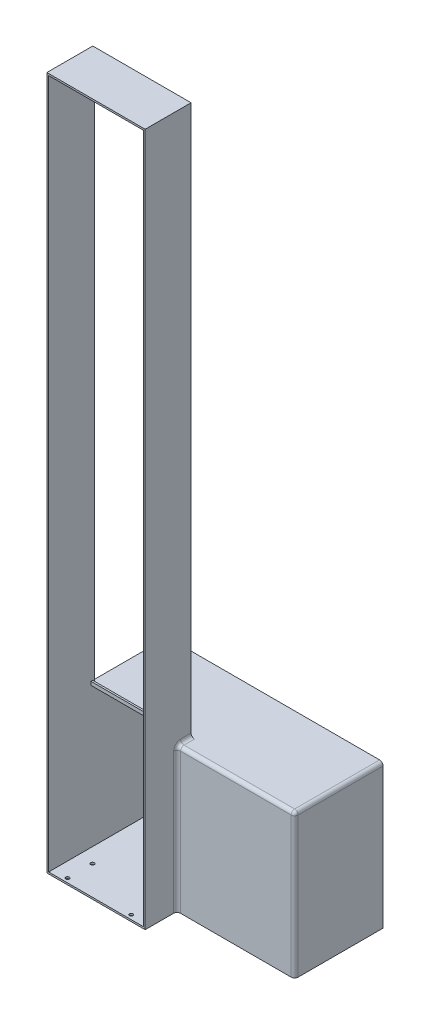
ISO-10303-21;
HEADER;
FILE_DESCRIPTION(('STEP AP214'),'2;1');
FILE_NAME('part.step','',(''),(''),'','','');
FILE_SCHEMA(('AUTOMOTIVE_DESIGN { 1 0 10303 214 1 1 1 1 }'));
ENDSEC;
DATA;
#1=APPLICATION_CONTEXT('core data for automotive mechanical design processes');
#2=APPLICATION_PROTOCOL_DEFINITION('international standard','automotive_design',2000,#1);
#3=PRODUCT_CONTEXT('',#1,'mechanical');
#4=PRODUCT('Part','Part','',(#3));
#5=PRODUCT_RELATED_PRODUCT_CATEGORY('part','',(#4));
#6=PRODUCT_DEFINITION_FORMATION('','',#4);
#7=PRODUCT_DEFINITION_CONTEXT('part definition',#1,'design');
#8=PRODUCT_DEFINITION('design','',#6,#7);
#9=PRODUCT_DEFINITION_SHAPE('','',#8);
#10=(LENGTH_UNIT() NAMED_UNIT(*) SI_UNIT(.MILLI.,.METRE.));
#11=(NAMED_UNIT(*) PLANE_ANGLE_UNIT() SI_UNIT($,.RADIAN.));
#12=(NAMED_UNIT(*) SI_UNIT($,.STERADIAN.) SOLID_ANGLE_UNIT());
#13=UNCERTAINTY_MEASURE_WITH_UNIT(LENGTH_MEASURE(1.E-05),#10,'distance_accuracy_value','');
#14=(GEOMETRIC_REPRESENTATION_CONTEXT(3) GLOBAL_UNCERTAINTY_ASSIGNED_CONTEXT((#13)) GLOBAL_UNIT_ASSIGNED_CONTEXT((#10,
#11,#12)) REPRESENTATION_CONTEXT('',''));
#15=CARTESIAN_POINT('',(0.,0.,0.));
#16=DIRECTION('',(0.,0.,1.));
#17=DIRECTION('',(1.,0.,0.));
#18=AXIS2_PLACEMENT_3D('',#15,#16,#17);
#19=CARTESIAN_POINT('',(-135.,-585.61875,-252.6145));
#20=DIRECTION('',(-1.,0.,0.));
#21=DIRECTION('',(0.,0.,1.));
#22=AXIS2_PLACEMENT_3D('',#19,#20,#21);
#23=PLANE('',#22);
#24=DIRECTION('',(0.,-1.,0.));
#25=VECTOR('',#24,1.);
#26=CARTESIAN_POINT('',(-135.,-585.61875,-35.3945000000002));
#27=LINE('',#26,#25);
#28=CARTESIAN_POINT('',(-135.,-575.61875,-35.3945000000002));
#29=VERTEX_POINT('',#28);
#30=CARTESIAN_POINT('',(-135.,-580.61875,-35.3945000000002));
#31=VERTEX_POINT('',#30);
#32=EDGE_CURVE('E470',#29,#31,#27,.T.);
#33=ORIENTED_EDGE('',*,*,#32,.T.);
#34=DIRECTION('',(0.,0.,1.));
#35=VECTOR('',#34,1.);
#36=CARTESIAN_POINT('',(-135.,-580.61875,0.));
#37=LINE('',#36,#35);
#38=CARTESIAN_POINT('',(-135.,-580.61875,-40.3945000000002));
#39=VERTEX_POINT('',#38);
#40=EDGE_CURVE('E367',#39,#31,#37,.T.);
#41=ORIENTED_EDGE('',*,*,#40,.F.);
#42=DIRECTION('',(0.,-1.,0.));
#43=VECTOR('',#42,1.);
#44=CARTESIAN_POINT('',(-135.,979.38125,-40.3945000000002));
#45=LINE('',#44,#43);
#46=CARTESIAN_POINT('',(-135.,979.38125,-40.3945000000002));
#47=VERTEX_POINT('',#46);
#48=EDGE_CURVE('E245',#47,#39,#45,.T.);
#49=ORIENTED_EDGE('',*,*,#48,.F.);
#50=DIRECTION('',(0.,0.,-1.));
#51=VECTOR('',#50,1.);
#52=CARTESIAN_POINT('',(-135.,979.38125,90.3874999999998));
#53=LINE('',#52,#51);
#54=CARTESIAN_POINT('',(-135.,979.38125,90.3874999999998));
#55=VERTEX_POINT('',#54);
#56=EDGE_CURVE('E239',#55,#47,#53,.T.);
#57=ORIENTED_EDGE('',*,*,#56,.F.);
#58=DIRECTION('',(0.,-1.,0.));
#59=VECTOR('',#58,1.);
#60=CARTESIAN_POINT('',(-135.,-585.61875,90.3874999999998));
#61=LINE('',#60,#59);
#62=CARTESIAN_POINT('',(-135.,-985.61875,90.3874999999998));
#63=VERTEX_POINT('',#62);
#64=EDGE_CURVE('E304',#55,#63,#61,.T.);
#65=ORIENTED_EDGE('',*,*,#64,.T.);
#66=DIRECTION('',(0.,0.,-1.));
#67=VECTOR('',#66,1.);
#68=CARTESIAN_POINT('',(-135.,-985.61875,-252.6145));
#69=LINE('',#68,#67);
#70=CARTESIAN_POINT('',(-135.,-985.61875,-252.6145));
#71=VERTEX_POINT('',#70);
#72=EDGE_CURVE('E298',#63,#71,#69,.T.);
#73=ORIENTED_EDGE('',*,*,#72,.T.);
#74=DIRECTION('',(0.,-1.,0.));
#75=VECTOR('',#74,1.);
#76=CARTESIAN_POINT('',(-135.,-585.61875,-252.6145));
#77=LINE('',#76,#75);
#78=CARTESIAN_POINT('',(-135.,-585.61875,-252.6145));
#79=VERTEX_POINT('',#78);
#80=EDGE_CURVE('E301',#79,#71,#77,.T.);
#81=ORIENTED_EDGE('',*,*,#80,.F.);
#82=DIRECTION('',(0.,0.,-1.));
#83=VECTOR('',#82,1.);
#84=CARTESIAN_POINT('',(-135.,-585.61875,-252.6145));
#85=LINE('',#84,#83);
#86=CARTESIAN_POINT('',(-135.,-585.61875,-30.3945000000002));
#87=VERTEX_POINT('',#86);
#88=EDGE_CURVE('E50',#87,#79,#85,.T.);
#89=ORIENTED_EDGE('',*,*,#88,.F.);
#90=DIRECTION('',(0.,1.,0.));
#91=VECTOR('',#90,1.);
#92=CARTESIAN_POINT('',(-135.,-585.61875,-30.3945000000002));
#93=LINE('',#92,#91);
#94=CARTESIAN_POINT('',(-135.,-575.61875,-30.3945000000002));
#95=VERTEX_POINT('',#94);
#96=EDGE_CURVE('E54',#87,#95,#93,.T.);
#97=ORIENTED_EDGE('',*,*,#96,.T.);
#98=DIRECTION('',(0.,0.,-1.));
#99=VECTOR('',#98,1.);
#100=CARTESIAN_POINT('',(-135.,-575.61875,-35.3945000000002));
#101=LINE('',#100,#99);
#102=EDGE_CURVE('E472',#95,#29,#101,.T.);
#103=ORIENTED_EDGE('',*,*,#102,.T.);
#104=EDGE_LOOP('',(#33,#41,#49,#57,#65,#73,#81,#89,#97,#103));
#105=FACE_BOUND('',#104,.T.);
#106=ADVANCED_FACE('F33',(#105),#23,.F.);
#107=CARTESIAN_POINT('',(135.,-585.61875,90.3874999999998));
#108=DIRECTION('',(1.,0.,0.));
#109=DIRECTION('',(0.,0.,-1.));
#110=AXIS2_PLACEMENT_3D('',#107,#108,#109);
#111=PLANE('',#110);
#112=DIRECTION('',(0.,-1.,0.));
#113=VECTOR('',#112,1.);
#114=CARTESIAN_POINT('',(135.,-585.61875,-35.3945000000002));
#115=LINE('',#114,#113);
#116=CARTESIAN_POINT('',(135.,-575.61875,-35.3945000000003));
#117=VERTEX_POINT('',#116);
#118=CARTESIAN_POINT('',(135.,-580.61875,-35.3945000000002));
#119=VERTEX_POINT('',#118);
#120=EDGE_CURVE('E485',#117,#119,#115,.T.);
#121=ORIENTED_EDGE('',*,*,#120,.F.);
#122=DIRECTION('',(0.,0.,-1.));
#123=VECTOR('',#122,1.);
#124=CARTESIAN_POINT('',(135.,-575.61875,-35.3945000000002));
#125=LINE('',#124,#123);
#126=CARTESIAN_POINT('',(135.,-575.61875,-30.3945000000002));
#127=VERTEX_POINT('',#126);
#128=EDGE_CURVE('E478',#127,#117,#125,.T.);
#129=ORIENTED_EDGE('',*,*,#128,.F.);
#130=DIRECTION('',(0.,1.,0.));
#131=VECTOR('',#130,1.);
#132=CARTESIAN_POINT('',(135.,-585.61875,-30.3945000000002));
#133=LINE('',#132,#131);
#134=CARTESIAN_POINT('',(135.,-585.61875,-30.3945000000002));
#135=VERTEX_POINT('',#134);
#136=EDGE_CURVE('E484',#135,#127,#133,.T.);
#137=ORIENTED_EDGE('',*,*,#136,.F.);
#138=DIRECTION('',(0.,0.,1.));
#139=VECTOR('',#138,1.);
#140=CARTESIAN_POINT('',(135.,-585.61875,90.3874999999998));
#141=LINE('',#140,#139);
#142=CARTESIAN_POINT('',(135.,-585.61875,-5.53750000000025));
#143=VERTEX_POINT('',#142);
#144=EDGE_CURVE('E262',#135,#143,#141,.T.);
#145=ORIENTED_EDGE('',*,*,#144,.T.);
#146=DIRECTION('',(0.,-1.,0.));
#147=VECTOR('',#146,1.);
#148=CARTESIAN_POINT('',(135.,-585.61875,-5.53750000000025));
#149=LINE('',#148,#147);
#150=CARTESIAN_POINT('',(135.,-985.61875,-5.53750000000025));
#151=VERTEX_POINT('',#150);
#152=EDGE_CURVE('E290',#143,#151,#149,.T.);
#153=ORIENTED_EDGE('',*,*,#152,.T.);
#154=DIRECTION('',(0.,0.,1.));
#155=VECTOR('',#154,1.);
#156=CARTESIAN_POINT('',(135.,-985.61875,90.3874999999998));
#157=LINE('',#156,#155);
#158=CARTESIAN_POINT('',(135.,-985.61875,90.3874999999998));
#159=VERTEX_POINT('',#158);
#160=EDGE_CURVE('E280',#151,#159,#157,.T.);
#161=ORIENTED_EDGE('',*,*,#160,.T.);
#162=DIRECTION('',(0.,-1.,0.));
#163=VECTOR('',#162,1.);
#164=CARTESIAN_POINT('',(135.,-585.61875,90.3874999999998));
#165=LINE('',#164,#163);
#166=CARTESIAN_POINT('',(135.,979.38125,90.3874999999998));
#167=VERTEX_POINT('',#166);
#168=EDGE_CURVE('E283',#167,#159,#165,.T.);
#169=ORIENTED_EDGE('',*,*,#168,.F.);
#170=DIRECTION('',(0.,0.,1.));
#171=VECTOR('',#170,1.);
#172=CARTESIAN_POINT('',(135.,979.38125,90.3874999999998));
#173=LINE('',#172,#171);
#174=CARTESIAN_POINT('',(135.,979.38125,-40.3945000000002));
#175=VERTEX_POINT('',#174);
#176=EDGE_CURVE('E248',#175,#167,#173,.T.);
#177=ORIENTED_EDGE('',*,*,#176,.F.);
#178=DIRECTION('',(0.,-1.,0.));
#179=VECTOR('',#178,1.);
#180=CARTESIAN_POINT('',(135.,979.38125,-40.3945000000002));
#181=LINE('',#180,#179);
#182=CARTESIAN_POINT('',(135.,-580.61875,-40.3945000000002));
#183=VERTEX_POINT('',#182);
#184=EDGE_CURVE('E251',#175,#183,#181,.T.);
#185=ORIENTED_EDGE('',*,*,#184,.T.);
#186=DIRECTION('',(0.,0.,1.));
#187=VECTOR('',#186,1.);
#188=CARTESIAN_POINT('',(135.,-580.61875,90.3874999999998));
#189=LINE('',#188,#187);
#190=EDGE_CURVE('E252',#183,#119,#189,.T.);
#191=ORIENTED_EDGE('',*,*,#190,.T.);
#192=EDGE_LOOP('',(#121,#129,#137,#145,#153,#161,#169,#177,#185,#191));
#193=FACE_BOUND('',#192,.T.);
#194=ADVANCED_FACE('F498',(#193),#111,.F.);
#195=CARTESIAN_POINT('',(0.,-580.61875,0.));
#196=DIRECTION('',(0.,1.,0.));
#197=DIRECTION('',(0.,0.,1.));
#198=AXIS2_PLACEMENT_3D('',#195,#196,#197);
#199=PLANE('',#198);
#200=DIRECTION('',(1.,0.,0.));
#201=VECTOR('',#200,1.);
#202=CARTESIAN_POINT('',(474.951,-580.61875,-10.5375000000003));
#203=LINE('',#202,#201);
#204=CARTESIAN_POINT('',(150.,-580.61875,-10.5375000000003));
#205=VERTEX_POINT('',#204);
#206=CARTESIAN_POINT('',(464.951,-580.61875,-10.5375000000003));
#207=VERTEX_POINT('',#206);
#208=EDGE_CURVE('E385',#205,#207,#203,.T.);
#209=ORIENTED_EDGE('',*,*,#208,.T.);
#210=DIRECTION('',(0.,0.,-1.));
#211=VECTOR('',#210,1.);
#212=CARTESIAN_POINT('',(464.951,-580.61875,-252.6145));
#213=LINE('',#212,#211);
#214=CARTESIAN_POINT('',(464.951,-580.61875,-252.6145));
#215=VERTEX_POINT('',#214);
#216=EDGE_CURVE('E387',#207,#215,#213,.T.);
#217=ORIENTED_EDGE('',*,*,#216,.T.);
#218=DIRECTION('',(-1.,0.,0.));
#219=VECTOR('',#218,1.);
#220=CARTESIAN_POINT('',(-135.,-580.61875,-252.6145));
#221=LINE('',#220,#219);
#222=CARTESIAN_POINT('',(-140.,-580.61875,-252.6145));
#223=VERTEX_POINT('',#222);
#224=EDGE_CURVE('E263',#215,#223,#221,.T.);
#225=ORIENTED_EDGE('',*,*,#224,.T.);
#226=DIRECTION('',(0.,0.,1.));
#227=VECTOR('',#226,1.);
#228=CARTESIAN_POINT('',(-140.,-580.61875,-252.6145));
#229=LINE('',#228,#227);
#230=CARTESIAN_POINT('',(-140.,-580.61875,-40.3945000000002));
#231=VERTEX_POINT('',#230);
#232=EDGE_CURVE('E265',#223,#231,#229,.T.);
#233=ORIENTED_EDGE('',*,*,#232,.T.);
#234=DIRECTION('',(-1.,0.,0.));
#235=VECTOR('',#234,1.);
#236=CARTESIAN_POINT('',(-135.,-580.61875,-40.3945000000002));
#237=LINE('',#236,#235);
#238=EDGE_CURVE('E236',#39,#231,#237,.T.);
#239=ORIENTED_EDGE('',*,*,#238,.F.);
#240=ORIENTED_EDGE('',*,*,#40,.T.);
#241=DIRECTION('',(1.,0.,0.));
#242=VECTOR('',#241,1.);
#243=CARTESIAN_POINT('',(135.,-580.61875,-35.3945000000002));
#244=LINE('',#243,#242);
#245=EDGE_CURVE('E269',#31,#119,#244,.T.);
#246=ORIENTED_EDGE('',*,*,#245,.T.);
#247=ORIENTED_EDGE('',*,*,#190,.F.);
#248=DIRECTION('',(-1.,0.,0.));
#249=VECTOR('',#248,1.);
#250=CARTESIAN_POINT('',(135.,-580.61875,-40.3945000000002));
#251=LINE('',#250,#249);
#252=CARTESIAN_POINT('',(150.,-580.61875,-40.3945000000002));
#253=VERTEX_POINT('',#252);
#254=EDGE_CURVE('E247',#253,#183,#251,.T.);
#255=ORIENTED_EDGE('',*,*,#254,.F.);
#256=DIRECTION('',(0.,0.,-1.));
#257=VECTOR('',#256,1.);
#258=CARTESIAN_POINT('',(150.,-580.61875,0.));
#259=LINE('',#258,#257);
#260=EDGE_CURVE('E383',#253,#205,#259,.F.);
#261=ORIENTED_EDGE('',*,*,#260,.T.);
#262=EDGE_LOOP('',(#209,#217,#225,#233,#239,#240,#246,#247,#255,#261));
#263=FACE_BOUND('',#262,.T.);
#264=ADVANCED_FACE('F428',(#263),#199,.T.);
#265=CARTESIAN_POINT('',(0.,-985.61875,0.));
#266=DIRECTION('',(0.,1.,0.));
#267=DIRECTION('',(0.,0.,1.));
#268=AXIS2_PLACEMENT_3D('',#265,#266,#267);
#269=PLANE('',#268);
#270=CARTESIAN_POINT('',(-92.9999999999998,-985.61875,78.3874999999998));
#271=DIRECTION('',(0.,-1.,0.));
#272=DIRECTION('',(0.,0.,-1.));
#273=AXIS2_PLACEMENT_3D('',#270,#271,#272);
#274=CIRCLE('',#273,5.00000000000001);
#275=CARTESIAN_POINT('',(-92.9999999999998,-985.61875,73.3874999999998));
#276=VERTEX_POINT('',#275);
#277=EDGE_CURVE('E311',#276,#276,#274,.T.);
#278=ORIENTED_EDGE('',*,*,#277,.T.);
#279=EDGE_LOOP('',(#278));
#280=FACE_BOUND('',#279,.T.);
#281=CARTESIAN_POINT('',(88.0000000000002,-985.61875,7.38749999999978));
#282=DIRECTION('',(0.,-1.,0.));
#283=DIRECTION('',(0.,0.,-1.));
#284=AXIS2_PLACEMENT_3D('',#281,#282,#283);
#285=CIRCLE('',#284,5.);
#286=CARTESIAN_POINT('',(88.0000000000002,-985.61875,2.38749999999978));
#287=VERTEX_POINT('',#286);
#288=EDGE_CURVE('E323',#287,#287,#285,.T.);
#289=ORIENTED_EDGE('',*,*,#288,.T.);
#290=EDGE_LOOP('',(#289));
#291=FACE_BOUND('',#290,.T.);
#292=CARTESIAN_POINT('',(88.0000000000002,-985.61875,-194.6125));
#293=DIRECTION('',(0.,-1.,0.));
#294=DIRECTION('',(0.,0.,-1.));
#295=AXIS2_PLACEMENT_3D('',#292,#293,#294);
#296=CIRCLE('',#295,5.00000000000001);
#297=CARTESIAN_POINT('',(88.0000000000002,-985.61875,-199.6125));
#298=VERTEX_POINT('',#297);
#299=EDGE_CURVE('E335',#298,#298,#296,.T.);
#300=ORIENTED_EDGE('',*,*,#299,.T.);
#301=EDGE_LOOP('',(#300));
#302=FACE_BOUND('',#301,.T.);
#303=CARTESIAN_POINT('',(-92.9999999999998,-985.61875,-194.6125));
#304=DIRECTION('',(0.,-1.,0.));
#305=DIRECTION('',(0.,0.,-1.));
#306=AXIS2_PLACEMENT_3D('',#303,#304,#305);
#307=CIRCLE('',#306,5.00000000000001);
#308=CARTESIAN_POINT('',(-92.9999999999998,-985.61875,-199.6125));
#309=VERTEX_POINT('',#308);
#310=EDGE_CURVE('E329',#309,#309,#307,.T.);
#311=ORIENTED_EDGE('',*,*,#310,.T.);
#312=EDGE_LOOP('',(#311));
#313=FACE_BOUND('',#312,.T.);
#314=CARTESIAN_POINT('',(-92.9999999999998,-985.61875,7.38749999999978));
#315=DIRECTION('',(0.,-1.,0.));
#316=DIRECTION('',(0.,0.,-1.));
#317=AXIS2_PLACEMENT_3D('',#314,#315,#316);
#318=CIRCLE('',#317,5.);
#319=CARTESIAN_POINT('',(-92.9999999999998,-985.61875,2.38749999999978));
#320=VERTEX_POINT('',#319);
#321=EDGE_CURVE('E317',#320,#320,#318,.T.);
#322=ORIENTED_EDGE('',*,*,#321,.T.);
#323=EDGE_LOOP('',(#322));
#324=FACE_BOUND('',#323,.T.);
#325=CARTESIAN_POINT('',(88.0000000000002,-985.61875,78.3874999999998));
#326=DIRECTION('',(0.,-1.,0.));
#327=DIRECTION('',(0.,0.,-1.));
#328=AXIS2_PLACEMENT_3D('',#325,#326,#327);
#329=CIRCLE('',#328,5.00000000000001);
#330=CARTESIAN_POINT('',(88.0000000000002,-985.61875,73.3874999999998));
#331=VERTEX_POINT('',#330);
#332=EDGE_CURVE('E307',#331,#331,#329,.T.);
#333=ORIENTED_EDGE('',*,*,#332,.T.);
#334=EDGE_LOOP('',(#333));
#335=FACE_BOUND('',#334,.T.);
#336=DIRECTION('',(-1.,0.,0.));
#337=VECTOR('',#336,1.);
#338=CARTESIAN_POINT('',(135.,-985.61875,-5.53750000000025));
#339=LINE('',#338,#337);
#340=CARTESIAN_POINT('',(469.951,-985.61875,-5.53750000000025));
#341=VERTEX_POINT('',#340);
#342=EDGE_CURVE('E285',#341,#151,#339,.T.);
#343=ORIENTED_EDGE('',*,*,#342,.F.);
#344=DIRECTION('',(0.,0.,1.));
#345=VECTOR('',#344,1.);
#346=CARTESIAN_POINT('',(469.951,-985.61875,-5.53750000000025));
#347=LINE('',#346,#345);
#348=CARTESIAN_POINT('',(469.951,-985.61875,-252.6145));
#349=VERTEX_POINT('',#348);
#350=EDGE_CURVE('E275',#349,#341,#347,.T.);
#351=ORIENTED_EDGE('',*,*,#350,.F.);
#352=DIRECTION('',(1.,0.,0.));
#353=VECTOR('',#352,1.);
#354=CARTESIAN_POINT('',(474.951,-985.61875,-252.6145));
#355=LINE('',#354,#353);
#356=EDGE_CURVE('E341',#71,#349,#355,.T.);
#357=ORIENTED_EDGE('',*,*,#356,.F.);
#358=ORIENTED_EDGE('',*,*,#72,.F.);
#359=DIRECTION('',(-1.,0.,0.));
#360=VECTOR('',#359,1.);
#361=CARTESIAN_POINT('',(-140.,-985.61875,90.3874999999998));
#362=LINE('',#361,#360);
#363=EDGE_CURVE('E346',#159,#63,#362,.T.);
#364=ORIENTED_EDGE('',*,*,#363,.F.);
#365=ORIENTED_EDGE('',*,*,#160,.F.);
#366=EDGE_LOOP('',(#343,#351,#357,#358,#364,#365));
#367=FACE_BOUND('',#366,.T.);
#368=ADVANCED_FACE('F545',(#280,#291,#302,#313,#324,#335,#367),#269,.T.);
#369=CARTESIAN_POINT('',(0.,-990.61875,0.));
#370=DIRECTION('',(0.,1.,0.));
#371=DIRECTION('',(0.,0.,1.));
#372=AXIS2_PLACEMENT_3D('',#369,#370,#371);
#373=PLANE('',#372);
#374=DIRECTION('',(0.,0.,1.));
#375=VECTOR('',#374,1.);
#376=CARTESIAN_POINT('',(474.951,-990.61875,-0.537500000000255));
#377=LINE('',#376,#375);
#378=CARTESIAN_POINT('',(474.951,-990.61875,-252.6145));
#379=VERTEX_POINT('',#378);
#380=CARTESIAN_POINT('',(474.951,-990.61875,-10.5375000000003));
#381=VERTEX_POINT('',#380);
#382=EDGE_CURVE('E348',#379,#381,#377,.T.);
#383=ORIENTED_EDGE('',*,*,#382,.T.);
#384=CARTESIAN_POINT('',(464.951,-990.61875,-10.5375000000003));
#385=DIRECTION('',(0.,1.,0.));
#386=DIRECTION('',(0.,0.,1.));
#387=AXIS2_PLACEMENT_3D('',#384,#385,#386);
#388=CIRCLE('',#387,10.);
#389=CARTESIAN_POINT('',(464.951,-990.61875,-0.537500000000255));
#390=VERTEX_POINT('',#389);
#391=EDGE_CURVE('E381',#381,#390,#388,.F.);
#392=ORIENTED_EDGE('',*,*,#391,.T.);
#393=DIRECTION('',(-1.,0.,0.));
#394=VECTOR('',#393,1.);
#395=CARTESIAN_POINT('',(140.,-990.61875,-0.537500000000255));
#396=LINE('',#395,#394);
#397=CARTESIAN_POINT('',(150.,-990.61875,-0.537500000000255));
#398=VERTEX_POINT('',#397);
#399=EDGE_CURVE('E351',#390,#398,#396,.T.);
#400=ORIENTED_EDGE('',*,*,#399,.T.);
#401=CARTESIAN_POINT('',(150.,-990.61875,9.46249999999975));
#402=DIRECTION('',(0.,1.,0.));
#403=DIRECTION('',(0.,0.,1.));
#404=AXIS2_PLACEMENT_3D('',#401,#402,#403);
#405=CIRCLE('',#404,10.);
#406=CARTESIAN_POINT('',(140.,-990.61875,9.46249999999975));
#407=VERTEX_POINT('',#406);
#408=EDGE_CURVE('E11',#398,#407,#405,.T.);
#409=ORIENTED_EDGE('',*,*,#408,.T.);
#410=DIRECTION('',(0.,0.,1.));
#411=VECTOR('',#410,1.);
#412=CARTESIAN_POINT('',(140.,-990.61875,90.3874999999998));
#413=LINE('',#412,#411);
#414=CARTESIAN_POINT('',(140.,-990.61875,90.3874999999998));
#415=VERTEX_POINT('',#414);
#416=EDGE_CURVE('E354',#407,#415,#413,.T.);
#417=ORIENTED_EDGE('',*,*,#416,.T.);
#418=DIRECTION('',(-1.,0.,0.));
#419=VECTOR('',#418,1.);
#420=CARTESIAN_POINT('',(-140.,-990.61875,90.3874999999998));
#421=LINE('',#420,#419);
#422=CARTESIAN_POINT('',(-140.,-990.61875,90.3874999999998));
#423=VERTEX_POINT('',#422);
#424=EDGE_CURVE('E209',#415,#423,#421,.T.);
#425=ORIENTED_EDGE('',*,*,#424,.T.);
#426=DIRECTION('',(0.,0.,-1.));
#427=VECTOR('',#426,1.);
#428=CARTESIAN_POINT('',(-140.,-990.61875,-252.6145));
#429=LINE('',#428,#427);
#430=CARTESIAN_POINT('',(-140.,-990.61875,-252.6145));
#431=VERTEX_POINT('',#430);
#432=EDGE_CURVE('E205',#423,#431,#429,.T.);
#433=ORIENTED_EDGE('',*,*,#432,.T.);
#434=DIRECTION('',(1.,0.,0.));
#435=VECTOR('',#434,1.);
#436=CARTESIAN_POINT('',(474.951,-990.61875,-252.6145));
#437=LINE('',#436,#435);
#438=EDGE_CURVE('E345',#431,#379,#437,.T.);
#439=ORIENTED_EDGE('',*,*,#438,.T.);
#440=EDGE_LOOP('',(#383,#392,#400,#409,#417,#425,#433,#439));
#441=FACE_BOUND('',#440,.T.);
#442=CARTESIAN_POINT('',(88.0000000000002,-990.61875,-194.6125));
#443=DIRECTION('',(0.,-1.,0.));
#444=DIRECTION('',(0.,0.,-1.));
#445=AXIS2_PLACEMENT_3D('',#442,#443,#444);
#446=CIRCLE('',#445,5.00000000000001);
#447=CARTESIAN_POINT('',(88.0000000000002,-990.61875,-199.6125));
#448=VERTEX_POINT('',#447);
#449=EDGE_CURVE('E338',#448,#448,#446,.T.);
#450=ORIENTED_EDGE('',*,*,#449,.F.);
#451=EDGE_LOOP('',(#450));
#452=FACE_BOUND('',#451,.T.);
#453=CARTESIAN_POINT('',(-92.9999999999998,-990.61875,-194.6125));
#454=DIRECTION('',(0.,-1.,0.));
#455=DIRECTION('',(0.,0.,-1.));
#456=AXIS2_PLACEMENT_3D('',#453,#454,#455);
#457=CIRCLE('',#456,5.00000000000001);
#458=CARTESIAN_POINT('',(-92.9999999999998,-990.61875,-199.6125));
#459=VERTEX_POINT('',#458);
#460=EDGE_CURVE('E332',#459,#459,#457,.T.);
#461=ORIENTED_EDGE('',*,*,#460,.F.);
#462=EDGE_LOOP('',(#461));
#463=FACE_BOUND('',#462,.T.);
#464=CARTESIAN_POINT('',(88.0000000000002,-990.61875,7.38749999999978));
#465=DIRECTION('',(0.,-1.,0.));
#466=DIRECTION('',(0.,0.,-1.));
#467=AXIS2_PLACEMENT_3D('',#464,#465,#466);
#468=CIRCLE('',#467,5.);
#469=CARTESIAN_POINT('',(88.0000000000002,-990.61875,2.38749999999978));
#470=VERTEX_POINT('',#469);
#471=EDGE_CURVE('E326',#470,#470,#468,.T.);
#472=ORIENTED_EDGE('',*,*,#471,.F.);
#473=EDGE_LOOP('',(#472));
#474=FACE_BOUND('',#473,.T.);
#475=CARTESIAN_POINT('',(-92.9999999999998,-990.61875,7.38749999999978));
#476=DIRECTION('',(0.,-1.,0.));
#477=DIRECTION('',(0.,0.,-1.));
#478=AXIS2_PLACEMENT_3D('',#475,#476,#477);
#479=CIRCLE('',#478,5.);
#480=CARTESIAN_POINT('',(-92.9999999999998,-990.61875,2.38749999999978));
#481=VERTEX_POINT('',#480);
#482=EDGE_CURVE('E320',#481,#481,#479,.T.);
#483=ORIENTED_EDGE('',*,*,#482,.F.);
#484=EDGE_LOOP('',(#483));
#485=FACE_BOUND('',#484,.T.);
#486=CARTESIAN_POINT('',(-92.9999999999998,-990.61875,78.3874999999998));
#487=DIRECTION('',(0.,-1.,0.));
#488=DIRECTION('',(0.,0.,-1.));
#489=AXIS2_PLACEMENT_3D('',#486,#487,#488);
#490=CIRCLE('',#489,5.00000000000001);
#491=CARTESIAN_POINT('',(-92.9999999999998,-990.61875,73.3874999999998));
#492=VERTEX_POINT('',#491);
#493=EDGE_CURVE('E314',#492,#492,#490,.T.);
#494=ORIENTED_EDGE('',*,*,#493,.F.);
#495=EDGE_LOOP('',(#494));
#496=FACE_BOUND('',#495,.T.);
#497=CARTESIAN_POINT('',(88.0000000000002,-990.61875,78.3874999999998));
#498=DIRECTION('',(0.,-1.,0.));
#499=DIRECTION('',(0.,0.,-1.));
#500=AXIS2_PLACEMENT_3D('',#497,#498,#499);
#501=CIRCLE('',#500,5.00000000000001);
#502=CARTESIAN_POINT('',(88.0000000000002,-990.61875,73.3874999999998));
#503=VERTEX_POINT('',#502);
#504=EDGE_CURVE('E308',#503,#503,#501,.T.);
#505=ORIENTED_EDGE('',*,*,#504,.F.);
#506=EDGE_LOOP('',(#505));
#507=FACE_BOUND('',#506,.T.);
#508=ADVANCED_FACE('F446',(#441,#452,#463,#474,#485,#496,#507),#373,.F.);
#509=CARTESIAN_POINT('',(-140.,-990.61875,-252.6145));
#510=DIRECTION('',(1.,0.,0.));
#511=DIRECTION('',(0.,0.,-1.));
#512=AXIS2_PLACEMENT_3D('',#509,#510,#511);
#513=PLANE('',#512);
#514=DIRECTION('',(0.,1.,0.));
#515=VECTOR('',#514,1.);
#516=CARTESIAN_POINT('',(-140.,-990.61875,90.3874999999998));
#517=LINE('',#516,#515);
#518=CARTESIAN_POINT('',(-140.,984.38125,90.3874999999998));
#519=VERTEX_POINT('',#518);
#520=EDGE_CURVE('E197',#423,#519,#517,.T.);
#521=ORIENTED_EDGE('',*,*,#520,.T.);
#522=DIRECTION('',(0.,0.,1.));
#523=VECTOR('',#522,1.);
#524=CARTESIAN_POINT('',(-140.,984.38125,90.3874999999998));
#525=LINE('',#524,#523);
#526=CARTESIAN_POINT('',(-140.,984.38125,-40.3945000000002));
#527=VERTEX_POINT('',#526);
#528=EDGE_CURVE('E202',#527,#519,#525,.T.);
#529=ORIENTED_EDGE('',*,*,#528,.F.);
#530=DIRECTION('',(0.,-1.,0.));
#531=VECTOR('',#530,1.);
#532=CARTESIAN_POINT('',(-140.,979.38125,-40.3945000000002));
#533=LINE('',#532,#531);
#534=EDGE_CURVE('E242',#527,#231,#533,.T.);
#535=ORIENTED_EDGE('',*,*,#534,.T.);
#536=ORIENTED_EDGE('',*,*,#232,.F.);
#537=DIRECTION('',(0.,1.,0.));
#538=VECTOR('',#537,1.);
#539=CARTESIAN_POINT('',(-140.,-990.61875,-252.6145));
#540=LINE('',#539,#538);
#541=EDGE_CURVE('E364',#431,#223,#540,.T.);
#542=ORIENTED_EDGE('',*,*,#541,.F.);
#543=ORIENTED_EDGE('',*,*,#432,.F.);
#544=EDGE_LOOP('',(#521,#529,#535,#536,#542,#543));
#545=FACE_BOUND('',#544,.T.);
#546=ADVANCED_FACE('F199',(#545),#513,.F.);
#547=CARTESIAN_POINT('',(474.951,-990.61875,-252.6145));
#548=DIRECTION('',(0.,0.,1.));
#549=DIRECTION('',(1.,0.,0.));
#550=AXIS2_PLACEMENT_3D('',#547,#548,#549);
#551=PLANE('',#550);
#552=ORIENTED_EDGE('',*,*,#224,.F.);
#553=CARTESIAN_POINT('',(464.951,-590.61875,-252.6145));
#554=DIRECTION('',(0.,0.,1.));
#555=DIRECTION('',(1.,0.,0.));
#556=AXIS2_PLACEMENT_3D('',#553,#554,#555);
#557=CIRCLE('',#556,10.);
#558=CARTESIAN_POINT('',(474.951,-590.61875,-252.6145));
#559=VERTEX_POINT('',#558);
#560=EDGE_CURVE('E389',#215,#559,#557,.F.);
#561=ORIENTED_EDGE('',*,*,#560,.T.);
#562=DIRECTION('',(0.,1.,0.));
#563=VECTOR('',#562,1.);
#564=CARTESIAN_POINT('',(474.951,-990.61875,-252.6145));
#565=LINE('',#564,#563);
#566=EDGE_CURVE('E361',#379,#559,#565,.T.);
#567=ORIENTED_EDGE('',*,*,#566,.F.);
#568=ORIENTED_EDGE('',*,*,#438,.F.);
#569=ORIENTED_EDGE('',*,*,#541,.T.);
#570=EDGE_LOOP('',(#552,#561,#567,#568,#569));
#571=FACE_BOUND('',#570,.T.);
#572=DIRECTION('',(-1.,0.,0.));
#573=VECTOR('',#572,1.);
#574=CARTESIAN_POINT('',(-135.,-585.61875,-252.6145));
#575=LINE('',#574,#573);
#576=CARTESIAN_POINT('',(469.951,-585.61875,-252.6145));
#577=VERTEX_POINT('',#576);
#578=EDGE_CURVE('E266',#577,#79,#575,.T.);
#579=ORIENTED_EDGE('',*,*,#578,.T.);
#580=ORIENTED_EDGE('',*,*,#80,.T.);
#581=ORIENTED_EDGE('',*,*,#356,.T.);
#582=DIRECTION('',(0.,-1.,0.));
#583=VECTOR('',#582,1.);
#584=CARTESIAN_POINT('',(469.951,-585.61875,-252.6145));
#585=LINE('',#584,#583);
#586=EDGE_CURVE('E296',#577,#349,#585,.T.);
#587=ORIENTED_EDGE('',*,*,#586,.F.);
#588=EDGE_LOOP('',(#579,#580,#581,#587));
#589=FACE_BOUND('',#588,.T.);
#590=ADVANCED_FACE('F439',(#571,#589),#551,.F.);
#591=CARTESIAN_POINT('',(474.951,-990.61875,-0.537500000000255));
#592=DIRECTION('',(-1.,0.,0.));
#593=DIRECTION('',(0.,0.,1.));
#594=AXIS2_PLACEMENT_3D('',#591,#592,#593);
#595=PLANE('',#594);
#596=DIRECTION('',(0.,0.,-1.));
#597=VECTOR('',#596,1.);
#598=CARTESIAN_POINT('',(474.951,-590.61875,-0.537500000000255));
#599=LINE('',#598,#597);
#600=CARTESIAN_POINT('',(474.951,-590.61875,-10.5375000000003));
#601=VERTEX_POINT('',#600);
#602=EDGE_CURVE('E377',#559,#601,#599,.F.);
#603=ORIENTED_EDGE('',*,*,#602,.T.);
#604=DIRECTION('',(0.,1.,0.));
#605=VECTOR('',#604,1.);
#606=CARTESIAN_POINT('',(474.951,-990.61875,-10.5375000000003));
#607=LINE('',#606,#605);
#608=EDGE_CURVE('E379',#601,#381,#607,.F.);
#609=ORIENTED_EDGE('',*,*,#608,.T.);
#610=ORIENTED_EDGE('',*,*,#382,.F.);
#611=ORIENTED_EDGE('',*,*,#566,.T.);
#612=EDGE_LOOP('',(#603,#609,#610,#611));
#613=FACE_BOUND('',#612,.T.);
#614=ADVANCED_FACE('F443',(#613),#595,.F.);
#615=CARTESIAN_POINT('',(140.,-990.61875,-0.537500000000255));
#616=DIRECTION('',(0.,0.,-1.));
#617=DIRECTION('',(-1.,0.,0.));
#618=AXIS2_PLACEMENT_3D('',#615,#616,#617);
#619=PLANE('',#618);
#620=ORIENTED_EDGE('',*,*,#399,.F.);
#621=DIRECTION('',(0.,1.,0.));
#622=VECTOR('',#621,1.);
#623=CARTESIAN_POINT('',(464.951,-990.61875,-0.537500000000255));
#624=LINE('',#623,#622);
#625=CARTESIAN_POINT('',(464.951,-590.61875,-0.537500000000255));
#626=VERTEX_POINT('',#625);
#627=EDGE_CURVE('E374',#390,#626,#624,.T.);
#628=ORIENTED_EDGE('',*,*,#627,.T.);
#629=DIRECTION('',(1.,0.,0.));
#630=VECTOR('',#629,1.);
#631=CARTESIAN_POINT('',(140.,-590.61875,-0.537500000000255));
#632=LINE('',#631,#630);
#633=CARTESIAN_POINT('',(150.,-590.61875,-0.537500000000255));
#634=VERTEX_POINT('',#633);
#635=EDGE_CURVE('E372',#626,#634,#632,.F.);
#636=ORIENTED_EDGE('',*,*,#635,.T.);
#637=DIRECTION('',(0.,1.,0.));
#638=VECTOR('',#637,1.);
#639=CARTESIAN_POINT('',(150.,-990.61875,-0.537500000000255));
#640=LINE('',#639,#638);
#641=EDGE_CURVE('E370',#634,#398,#640,.F.);
#642=ORIENTED_EDGE('',*,*,#641,.T.);
#643=EDGE_LOOP('',(#620,#628,#636,#642));
#644=FACE_BOUND('',#643,.T.);
#645=ADVANCED_FACE('F454',(#644),#619,.F.);
#646=CARTESIAN_POINT('',(140.,-990.61875,90.3874999999998));
#647=DIRECTION('',(-1.,0.,0.));
#648=DIRECTION('',(0.,0.,1.));
#649=AXIS2_PLACEMENT_3D('',#646,#647,#648);
#650=PLANE('',#649);
#651=CARTESIAN_POINT('',(140.,-590.61875,-10.5375000000003));
#652=DIRECTION('',(-1.,0.,0.));
#653=DIRECTION('',(0.,0.,1.));
#654=AXIS2_PLACEMENT_3D('',#651,#652,#653);
#655=CIRCLE('',#654,20.);
#656=CARTESIAN_POINT('',(140.,-570.61875,-10.5375000000003));
#657=VERTEX_POINT('',#656);
#658=CARTESIAN_POINT('',(140.,-590.61875,9.46249999999975));
#659=VERTEX_POINT('',#658);
#660=EDGE_CURVE('E391',#657,#659,#655,.F.);
#661=ORIENTED_EDGE('',*,*,#660,.F.);
#662=DIRECTION('',(0.,0.,-1.));
#663=VECTOR('',#662,1.);
#664=CARTESIAN_POINT('',(140.,-570.61875,90.3874999999998));
#665=LINE('',#664,#663);
#666=CARTESIAN_POINT('',(140.,-570.61875,-40.3945000000002));
#667=VERTEX_POINT('',#666);
#668=EDGE_CURVE('E396',#657,#667,#665,.T.);
#669=ORIENTED_EDGE('',*,*,#668,.T.);
#670=DIRECTION('',(0.,-1.,0.));
#671=VECTOR('',#670,1.);
#672=CARTESIAN_POINT('',(140.,979.38125,-40.3945000000002));
#673=LINE('',#672,#671);
#674=CARTESIAN_POINT('',(140.,984.38125,-40.3945000000002));
#675=VERTEX_POINT('',#674);
#676=EDGE_CURVE('E259',#675,#667,#673,.T.);
#677=ORIENTED_EDGE('',*,*,#676,.F.);
#678=DIRECTION('',(0.,0.,-1.));
#679=VECTOR('',#678,1.);
#680=CARTESIAN_POINT('',(140.,984.38125,90.3874999999998));
#681=LINE('',#680,#679);
#682=CARTESIAN_POINT('',(140.,984.38125,90.3874999999998));
#683=VERTEX_POINT('',#682);
#684=EDGE_CURVE('E219',#683,#675,#681,.T.);
#685=ORIENTED_EDGE('',*,*,#684,.F.);
#686=DIRECTION('',(0.,1.,0.));
#687=VECTOR('',#686,1.);
#688=CARTESIAN_POINT('',(140.,-990.61875,90.3874999999998));
#689=LINE('',#688,#687);
#690=EDGE_CURVE('E208',#415,#683,#689,.T.);
#691=ORIENTED_EDGE('',*,*,#690,.F.);
#692=ORIENTED_EDGE('',*,*,#416,.F.);
#693=DIRECTION('',(0.,1.,0.));
#694=VECTOR('',#693,1.);
#695=CARTESIAN_POINT('',(140.,-580.61875,9.46249999999975));
#696=LINE('',#695,#694);
#697=EDGE_CURVE('E394',#407,#659,#696,.T.);
#698=ORIENTED_EDGE('',*,*,#697,.T.);
#699=EDGE_LOOP('',(#661,#669,#677,#685,#691,#692,#698));
#700=FACE_BOUND('',#699,.T.);
#701=ADVANCED_FACE('F458',(#700),#650,.F.);
#702=CARTESIAN_POINT('',(-140.,-990.61875,90.3874999999998));
#703=DIRECTION('',(0.,0.,-1.));
#704=DIRECTION('',(-1.,0.,0.));
#705=AXIS2_PLACEMENT_3D('',#702,#703,#704);
#706=PLANE('',#705);
#707=ORIENTED_EDGE('',*,*,#690,.T.);
#708=DIRECTION('',(1.,0.,0.));
#709=VECTOR('',#708,1.);
#710=CARTESIAN_POINT('',(-140.,984.38125,90.3874999999998));
#711=LINE('',#710,#709);
#712=EDGE_CURVE('E212',#519,#683,#711,.T.);
#713=ORIENTED_EDGE('',*,*,#712,.F.);
#714=ORIENTED_EDGE('',*,*,#520,.F.);
#715=ORIENTED_EDGE('',*,*,#424,.F.);
#716=EDGE_LOOP('',(#707,#713,#714,#715));
#717=FACE_BOUND('',#716,.T.);
#718=DIRECTION('',(1.,0.,0.));
#719=VECTOR('',#718,1.);
#720=CARTESIAN_POINT('',(-140.,979.38125,90.3874999999998));
#721=LINE('',#720,#719);
#722=EDGE_CURVE('E228',#55,#167,#721,.T.);
#723=ORIENTED_EDGE('',*,*,#722,.T.);
#724=ORIENTED_EDGE('',*,*,#168,.T.);
#725=ORIENTED_EDGE('',*,*,#363,.T.);
#726=ORIENTED_EDGE('',*,*,#64,.F.);
#727=EDGE_LOOP('',(#723,#724,#725,#726));
#728=FACE_BOUND('',#727,.T.);
#729=ADVANCED_FACE('F213',(#717,#728),#706,.F.);
#730=CARTESIAN_POINT('',(88.0000000000002,-990.61875,-194.6125));
#731=DIRECTION('',(0.,1.,0.));
#732=DIRECTION('',(0.,0.,1.));
#733=AXIS2_PLACEMENT_3D('',#730,#731,#732);
#734=CYLINDRICAL_SURFACE('',#733,5.00000000000001);
#735=ORIENTED_EDGE('',*,*,#449,.T.);
#736=EDGE_LOOP('',(#735));
#737=FACE_BOUND('',#736,.T.);
#738=ORIENTED_EDGE('',*,*,#299,.F.);
#739=EDGE_LOOP('',(#738));
#740=FACE_BOUND('',#739,.T.);
#741=ADVANCED_FACE('F538',(#737,#740),#734,.F.);
#742=CARTESIAN_POINT('',(-92.9999999999998,-990.61875,-194.6125));
#743=DIRECTION('',(0.,1.,0.));
#744=DIRECTION('',(0.,0.,1.));
#745=AXIS2_PLACEMENT_3D('',#742,#743,#744);
#746=CYLINDRICAL_SURFACE('',#745,5.00000000000001);
#747=ORIENTED_EDGE('',*,*,#460,.T.);
#748=EDGE_LOOP('',(#747));
#749=FACE_BOUND('',#748,.T.);
#750=ORIENTED_EDGE('',*,*,#310,.F.);
#751=EDGE_LOOP('',(#750));
#752=FACE_BOUND('',#751,.T.);
#753=ADVANCED_FACE('F534',(#749,#752),#746,.F.);
#754=CARTESIAN_POINT('',(88.0000000000002,-990.61875,7.38749999999978));
#755=DIRECTION('',(0.,1.,0.));
#756=DIRECTION('',(0.,0.,1.));
#757=AXIS2_PLACEMENT_3D('',#754,#755,#756);
#758=CYLINDRICAL_SURFACE('',#757,5.);
#759=ORIENTED_EDGE('',*,*,#471,.T.);
#760=EDGE_LOOP('',(#759));
#761=FACE_BOUND('',#760,.T.);
#762=ORIENTED_EDGE('',*,*,#288,.F.);
#763=EDGE_LOOP('',(#762));
#764=FACE_BOUND('',#763,.T.);
#765=ADVANCED_FACE('F530',(#761,#764),#758,.F.);
#766=CARTESIAN_POINT('',(-92.9999999999998,-990.61875,7.38749999999978));
#767=DIRECTION('',(0.,1.,0.));
#768=DIRECTION('',(0.,0.,1.));
#769=AXIS2_PLACEMENT_3D('',#766,#767,#768);
#770=CYLINDRICAL_SURFACE('',#769,5.);
#771=ORIENTED_EDGE('',*,*,#482,.T.);
#772=EDGE_LOOP('',(#771));
#773=FACE_BOUND('',#772,.T.);
#774=ORIENTED_EDGE('',*,*,#321,.F.);
#775=EDGE_LOOP('',(#774));
#776=FACE_BOUND('',#775,.T.);
#777=ADVANCED_FACE('F526',(#773,#776),#770,.F.);
#778=CARTESIAN_POINT('',(-92.9999999999998,-990.61875,78.3874999999998));
#779=DIRECTION('',(0.,1.,0.));
#780=DIRECTION('',(0.,0.,1.));
#781=AXIS2_PLACEMENT_3D('',#778,#779,#780);
#782=CYLINDRICAL_SURFACE('',#781,5.00000000000001);
#783=ORIENTED_EDGE('',*,*,#493,.T.);
#784=EDGE_LOOP('',(#783));
#785=FACE_BOUND('',#784,.T.);
#786=ORIENTED_EDGE('',*,*,#277,.F.);
#787=EDGE_LOOP('',(#786));
#788=FACE_BOUND('',#787,.T.);
#789=ADVANCED_FACE('F522',(#785,#788),#782,.F.);
#790=CARTESIAN_POINT('',(88.0000000000002,-990.61875,78.3874999999998));
#791=DIRECTION('',(0.,1.,0.));
#792=DIRECTION('',(0.,0.,1.));
#793=AXIS2_PLACEMENT_3D('',#790,#791,#792);
#794=CYLINDRICAL_SURFACE('',#793,5.00000000000001);
#795=ORIENTED_EDGE('',*,*,#504,.T.);
#796=EDGE_LOOP('',(#795));
#797=FACE_BOUND('',#796,.T.);
#798=ORIENTED_EDGE('',*,*,#332,.F.);
#799=EDGE_LOOP('',(#798));
#800=FACE_BOUND('',#799,.T.);
#801=ADVANCED_FACE('F519',(#797,#800),#794,.F.);
#802=CARTESIAN_POINT('',(469.951,-585.61875,-5.53750000000025));
#803=DIRECTION('',(1.,0.,0.));
#804=DIRECTION('',(0.,0.,-1.));
#805=AXIS2_PLACEMENT_3D('',#802,#803,#804);
#806=PLANE('',#805);
#807=ORIENTED_EDGE('',*,*,#350,.T.);
#808=DIRECTION('',(0.,-1.,0.));
#809=VECTOR('',#808,1.);
#810=CARTESIAN_POINT('',(469.951,-585.61875,-5.53750000000025));
#811=LINE('',#810,#809);
#812=CARTESIAN_POINT('',(469.951,-585.61875,-5.53750000000025));
#813=VERTEX_POINT('',#812);
#814=EDGE_CURVE('E293',#813,#341,#811,.T.);
#815=ORIENTED_EDGE('',*,*,#814,.F.);
#816=DIRECTION('',(0.,0.,1.));
#817=VECTOR('',#816,1.);
#818=CARTESIAN_POINT('',(469.951,-585.61875,-5.53750000000025));
#819=LINE('',#818,#817);
#820=EDGE_CURVE('E276',#577,#813,#819,.T.);
#821=ORIENTED_EDGE('',*,*,#820,.F.);
#822=ORIENTED_EDGE('',*,*,#586,.T.);
#823=EDGE_LOOP('',(#807,#815,#821,#822));
#824=FACE_BOUND('',#823,.T.);
#825=ADVANCED_FACE('F517',(#824),#806,.F.);
#826=CARTESIAN_POINT('',(135.,-585.61875,-5.53750000000025));
#827=DIRECTION('',(0.,0.,1.));
#828=DIRECTION('',(1.,0.,0.));
#829=AXIS2_PLACEMENT_3D('',#826,#827,#828);
#830=PLANE('',#829);
#831=ORIENTED_EDGE('',*,*,#342,.T.);
#832=ORIENTED_EDGE('',*,*,#152,.F.);
#833=DIRECTION('',(-1.,0.,0.));
#834=VECTOR('',#833,1.);
#835=CARTESIAN_POINT('',(135.,-585.61875,-5.53750000000025));
#836=LINE('',#835,#834);
#837=EDGE_CURVE('E279',#813,#143,#836,.T.);
#838=ORIENTED_EDGE('',*,*,#837,.F.);
#839=ORIENTED_EDGE('',*,*,#814,.T.);
#840=EDGE_LOOP('',(#831,#832,#838,#839));
#841=FACE_BOUND('',#840,.T.);
#842=ADVANCED_FACE('F621',(#841),#830,.F.);
#843=CARTESIAN_POINT('',(0.,-585.61875,0.));
#844=DIRECTION('',(0.,1.,0.));
#845=DIRECTION('',(0.,0.,1.));
#846=AXIS2_PLACEMENT_3D('',#843,#844,#845);
#847=PLANE('',#846);
#848=ORIENTED_EDGE('',*,*,#144,.F.);
#849=DIRECTION('',(1.,0.,0.));
#850=VECTOR('',#849,1.);
#851=CARTESIAN_POINT('',(-146.180339887499,-585.61875,-30.3945000000002));
#852=LINE('',#851,#850);
#853=EDGE_CURVE('E482',#87,#135,#852,.T.);
#854=ORIENTED_EDGE('',*,*,#853,.F.);
#855=ORIENTED_EDGE('',*,*,#88,.T.);
#856=ORIENTED_EDGE('',*,*,#578,.F.);
#857=ORIENTED_EDGE('',*,*,#820,.T.);
#858=ORIENTED_EDGE('',*,*,#837,.T.);
#859=EDGE_LOOP('',(#848,#854,#855,#856,#857,#858));
#860=FACE_BOUND('',#859,.T.);
#861=ADVANCED_FACE('F615',(#860),#847,.F.);
#862=CARTESIAN_POINT('',(135.,979.38125,-40.3945000000002));
#863=DIRECTION('',(0.,0.,1.));
#864=DIRECTION('',(1.,0.,0.));
#865=AXIS2_PLACEMENT_3D('',#862,#863,#864);
#866=PLANE('',#865);
#867=ORIENTED_EDGE('',*,*,#254,.T.);
#868=ORIENTED_EDGE('',*,*,#184,.F.);
#869=DIRECTION('',(-1.,0.,0.));
#870=VECTOR('',#869,1.);
#871=CARTESIAN_POINT('',(-140.,979.38125,-40.3945000000002));
#872=LINE('',#871,#870);
#873=EDGE_CURVE('E225',#175,#47,#872,.T.);
#874=ORIENTED_EDGE('',*,*,#873,.T.);
#875=ORIENTED_EDGE('',*,*,#48,.T.);
#876=ORIENTED_EDGE('',*,*,#238,.T.);
#877=ORIENTED_EDGE('',*,*,#534,.F.);
#878=DIRECTION('',(-1.,0.,0.));
#879=VECTOR('',#878,1.);
#880=CARTESIAN_POINT('',(-140.,984.38125,-40.3945000000002));
#881=LINE('',#880,#879);
#882=EDGE_CURVE('E224',#675,#527,#881,.T.);
#883=ORIENTED_EDGE('',*,*,#882,.F.);
#884=ORIENTED_EDGE('',*,*,#676,.T.);
#885=CARTESIAN_POINT('',(150.,-570.61875,-40.3945000000002));
#886=DIRECTION('',(0.,0.,1.));
#887=DIRECTION('',(1.,0.,0.));
#888=AXIS2_PLACEMENT_3D('',#885,#886,#887);
#889=CIRCLE('',#888,10.);
#890=EDGE_CURVE('E42',#667,#253,#889,.T.);
#891=ORIENTED_EDGE('',*,*,#890,.T.);
#892=EDGE_LOOP('',(#867,#868,#874,#875,#876,#877,#883,#884,#891));
#893=FACE_BOUND('',#892,.T.);
#894=ADVANCED_FACE('F465',(#893),#866,.F.);
#895=CARTESIAN_POINT('',(0.,979.38125,0.));
#896=DIRECTION('',(0.,-1.,0.));
#897=DIRECTION('',(0.,0.,-1.));
#898=AXIS2_PLACEMENT_3D('',#895,#896,#897);
#899=PLANE('',#898);
#900=ORIENTED_EDGE('',*,*,#56,.T.);
#901=ORIENTED_EDGE('',*,*,#873,.F.);
#902=ORIENTED_EDGE('',*,*,#176,.T.);
#903=ORIENTED_EDGE('',*,*,#722,.F.);
#904=EDGE_LOOP('',(#900,#901,#902,#903));
#905=FACE_BOUND('',#904,.T.);
#906=ADVANCED_FACE('F727',(#905),#899,.T.);
#907=CARTESIAN_POINT('',(0.,984.38125,0.));
#908=DIRECTION('',(0.,-1.,0.));
#909=DIRECTION('',(0.,0.,-1.));
#910=AXIS2_PLACEMENT_3D('',#907,#908,#909);
#911=PLANE('',#910);
#912=ORIENTED_EDGE('',*,*,#528,.T.);
#913=ORIENTED_EDGE('',*,*,#712,.T.);
#914=ORIENTED_EDGE('',*,*,#684,.T.);
#915=ORIENTED_EDGE('',*,*,#882,.T.);
#916=EDGE_LOOP('',(#912,#913,#914,#915));
#917=FACE_BOUND('',#916,.T.);
#918=ADVANCED_FACE('F222',(#917),#911,.F.);
#919=CARTESIAN_POINT('',(150.,-990.61875,9.46249999999975));
#920=DIRECTION('',(0.,-1.,0.));
#921=DIRECTION('',(0.,0.,-1.));
#922=AXIS2_PLACEMENT_3D('',#919,#920,#921);
#923=CYLINDRICAL_SURFACE('',#922,10.);
#924=ORIENTED_EDGE('',*,*,#408,.F.);
#925=ORIENTED_EDGE('',*,*,#641,.F.);
#926=CARTESIAN_POINT('',(150.,-590.61875,9.46249999999975));
#927=DIRECTION('',(0.,-1.,0.));
#928=DIRECTION('',(0.,0.,-1.));
#929=AXIS2_PLACEMENT_3D('',#926,#927,#928);
#930=CIRCLE('',#929,10.);
#931=EDGE_CURVE('E37',#659,#634,#930,.T.);
#932=ORIENTED_EDGE('',*,*,#931,.F.);
#933=ORIENTED_EDGE('',*,*,#697,.F.);
#934=EDGE_LOOP('',(#924,#925,#932,#933));
#935=FACE_BOUND('',#934,.T.);
#936=ADVANCED_FACE('F35',(#935),#923,.F.);
#937=CARTESIAN_POINT('',(150.,-570.61875,90.3874999999998));
#938=DIRECTION('',(0.,0.,-1.));
#939=DIRECTION('',(-1.,0.,0.));
#940=AXIS2_PLACEMENT_3D('',#937,#938,#939);
#941=CYLINDRICAL_SURFACE('',#940,10.);
#942=ORIENTED_EDGE('',*,*,#890,.F.);
#943=ORIENTED_EDGE('',*,*,#668,.F.);
#944=CARTESIAN_POINT('',(150.,-570.61875,-10.5375000000003));
#945=DIRECTION('',(0.,0.,-1.));
#946=DIRECTION('',(-1.,0.,0.));
#947=AXIS2_PLACEMENT_3D('',#944,#945,#946);
#948=CIRCLE('',#947,10.);
#949=EDGE_CURVE('E410',#205,#657,#948,.T.);
#950=ORIENTED_EDGE('',*,*,#949,.F.);
#951=ORIENTED_EDGE('',*,*,#260,.F.);
#952=EDGE_LOOP('',(#942,#943,#950,#951));
#953=FACE_BOUND('',#952,.T.);
#954=ADVANCED_FACE('F502',(#953),#941,.F.);
#955=CARTESIAN_POINT('',(150.,-590.61875,-10.5375000000003));
#956=DIRECTION('',(-1.,0.,0.));
#957=DIRECTION('',(0.,0.,1.));
#958=AXIS2_PLACEMENT_3D('',#955,#956,#957);
#959=TOROIDAL_SURFACE('',#958,20.,10.);
#960=ORIENTED_EDGE('',*,*,#660,.T.);
#961=ORIENTED_EDGE('',*,*,#931,.T.);
#962=CARTESIAN_POINT('',(150.,-590.61875,-10.5375000000003));
#963=DIRECTION('',(-1.,0.,0.));
#964=DIRECTION('',(0.,0.,1.));
#965=AXIS2_PLACEMENT_3D('',#962,#963,#964);
#966=CIRCLE('',#965,10.);
#967=EDGE_CURVE('E408',#205,#634,#966,.F.);
#968=ORIENTED_EDGE('',*,*,#967,.F.);
#969=ORIENTED_EDGE('',*,*,#949,.T.);
#970=EDGE_LOOP('',(#960,#961,#968,#969));
#971=FACE_BOUND('',#970,.T.);
#972=ADVANCED_FACE('F417',(#971),#959,.F.);
#973=CARTESIAN_POINT('',(0.,-590.61875,-10.5375000000003));
#974=DIRECTION('',(-1.,0.,0.));
#975=DIRECTION('',(0.,0.,1.));
#976=AXIS2_PLACEMENT_3D('',#973,#974,#975);
#977=CYLINDRICAL_SURFACE('',#976,10.);
#978=ORIENTED_EDGE('',*,*,#967,.T.);
#979=ORIENTED_EDGE('',*,*,#635,.F.);
#980=CARTESIAN_POINT('',(464.951,-590.61875,-10.5375000000003));
#981=DIRECTION('',(1.,0.,0.));
#982=DIRECTION('',(0.,0.,-1.));
#983=AXIS2_PLACEMENT_3D('',#980,#981,#982);
#984=CIRCLE('',#983,10.);
#985=EDGE_CURVE('E405',#207,#626,#984,.T.);
#986=ORIENTED_EDGE('',*,*,#985,.F.);
#987=ORIENTED_EDGE('',*,*,#208,.F.);
#988=EDGE_LOOP('',(#978,#979,#986,#987));
#989=FACE_BOUND('',#988,.T.);
#990=ADVANCED_FACE('F424',(#989),#977,.T.);
#991=CARTESIAN_POINT('',(464.951,-590.61875,2.0477842307013E-13));
#992=DIRECTION('',(0.,0.,1.));
#993=DIRECTION('',(1.,0.,0.));
#994=AXIS2_PLACEMENT_3D('',#991,#992,#993);
#995=CYLINDRICAL_SURFACE('',#994,10.);
#996=ORIENTED_EDGE('',*,*,#560,.F.);
#997=ORIENTED_EDGE('',*,*,#216,.F.);
#998=CARTESIAN_POINT('',(464.951,-590.61875,-10.5375000000003));
#999=DIRECTION('',(0.,0.,1.));
#1000=DIRECTION('',(1.,0.,0.));
#1001=AXIS2_PLACEMENT_3D('',#998,#999,#1000);
#1002=CIRCLE('',#1001,10.);
#1003=EDGE_CURVE('E402',#601,#207,#1002,.T.);
#1004=ORIENTED_EDGE('',*,*,#1003,.F.);
#1005=ORIENTED_EDGE('',*,*,#602,.F.);
#1006=EDGE_LOOP('',(#996,#997,#1004,#1005));
#1007=FACE_BOUND('',#1006,.T.);
#1008=ADVANCED_FACE('F434',(#1007),#995,.T.);
#1009=CARTESIAN_POINT('',(464.951,-590.61875,-10.5375000000003));
#1010=DIRECTION('',(0.,0.,1.));
#1011=DIRECTION('',(1.,0.,0.));
#1012=AXIS2_PLACEMENT_3D('',#1009,#1010,#1011);
#1013=SPHERICAL_SURFACE('',#1012,10.);
#1014=ORIENTED_EDGE('',*,*,#1003,.T.);
#1015=ORIENTED_EDGE('',*,*,#985,.T.);
#1016=CARTESIAN_POINT('',(464.951,-590.61875,-10.5375000000003));
#1017=DIRECTION('',(0.,1.,0.));
#1018=DIRECTION('',(0.,0.,1.));
#1019=AXIS2_PLACEMENT_3D('',#1016,#1017,#1018);
#1020=CIRCLE('',#1019,10.);
#1021=EDGE_CURVE('E400',#601,#626,#1020,.F.);
#1022=ORIENTED_EDGE('',*,*,#1021,.F.);
#1023=EDGE_LOOP('',(#1014,#1015,#1022));
#1024=FACE_BOUND('',#1023,.T.);
#1025=ADVANCED_FACE('F563',(#1024),#1013,.T.);
#1026=CARTESIAN_POINT('',(464.951,-990.61875,-10.5375000000003));
#1027=DIRECTION('',(0.,1.,0.));
#1028=DIRECTION('',(0.,0.,1.));
#1029=AXIS2_PLACEMENT_3D('',#1026,#1027,#1028);
#1030=CYLINDRICAL_SURFACE('',#1029,10.);
#1031=ORIENTED_EDGE('',*,*,#391,.F.);
#1032=ORIENTED_EDGE('',*,*,#608,.F.);
#1033=ORIENTED_EDGE('',*,*,#1021,.T.);
#1034=ORIENTED_EDGE('',*,*,#627,.F.);
#1035=EDGE_LOOP('',(#1031,#1032,#1033,#1034));
#1036=FACE_BOUND('',#1035,.T.);
#1037=ADVANCED_FACE('F451',(#1036),#1030,.T.);
#1038=CARTESIAN_POINT('',(-146.180339887499,-585.61875,-35.3945000000002));
#1039=DIRECTION('',(0.,0.,1.));
#1040=DIRECTION('',(1.,0.,0.));
#1041=AXIS2_PLACEMENT_3D('',#1038,#1039,#1040);
#1042=PLANE('',#1041);
#1043=ORIENTED_EDGE('',*,*,#245,.F.);
#1044=ORIENTED_EDGE('',*,*,#32,.F.);
#1045=DIRECTION('',(1.,0.,0.));
#1046=VECTOR('',#1045,1.);
#1047=CARTESIAN_POINT('',(-146.180339887499,-575.61875,-35.3945000000002));
#1048=LINE('',#1047,#1046);
#1049=EDGE_CURVE('E231',#29,#117,#1048,.T.);
#1050=ORIENTED_EDGE('',*,*,#1049,.T.);
#1051=ORIENTED_EDGE('',*,*,#120,.T.);
#1052=EDGE_LOOP('',(#1043,#1044,#1050,#1051));
#1053=FACE_BOUND('',#1052,.T.);
#1054=ADVANCED_FACE('F495',(#1053),#1042,.F.);
#1055=CARTESIAN_POINT('',(-146.180339887499,-585.61875,-30.3945000000002));
#1056=DIRECTION('',(0.,0.,-1.));
#1057=DIRECTION('',(-1.,0.,0.));
#1058=AXIS2_PLACEMENT_3D('',#1055,#1056,#1057);
#1059=PLANE('',#1058);
#1060=ORIENTED_EDGE('',*,*,#96,.F.);
#1061=ORIENTED_EDGE('',*,*,#853,.T.);
#1062=ORIENTED_EDGE('',*,*,#136,.T.);
#1063=DIRECTION('',(1.,0.,0.));
#1064=VECTOR('',#1063,1.);
#1065=CARTESIAN_POINT('',(-146.180339887499,-575.61875,-30.3945000000002));
#1066=LINE('',#1065,#1064);
#1067=EDGE_CURVE('E486',#95,#127,#1066,.T.);
#1068=ORIENTED_EDGE('',*,*,#1067,.F.);
#1069=EDGE_LOOP('',(#1060,#1061,#1062,#1068));
#1070=FACE_BOUND('',#1069,.T.);
#1071=ADVANCED_FACE('F592',(#1070),#1059,.F.);
#1072=CARTESIAN_POINT('',(-146.180339887499,-575.61875,-35.3945000000002));
#1073=DIRECTION('',(0.,-1.,0.));
#1074=DIRECTION('',(0.,0.,-1.));
#1075=AXIS2_PLACEMENT_3D('',#1072,#1073,#1074);
#1076=PLANE('',#1075);
#1077=ORIENTED_EDGE('',*,*,#102,.F.);
#1078=ORIENTED_EDGE('',*,*,#1067,.T.);
#1079=ORIENTED_EDGE('',*,*,#128,.T.);
#1080=ORIENTED_EDGE('',*,*,#1049,.F.);
#1081=EDGE_LOOP('',(#1077,#1078,#1079,#1080));
#1082=FACE_BOUND('',#1081,.T.);
#1083=ADVANCED_FACE('F496',(#1082),#1076,.F.);
#1084=CLOSED_SHELL('',(#106,#194,#264,#368,#508,#546,#590,#614,#645,#701,#729,#741,#753,#765,
#777,#789,#801,#825,#842,#861,#894,#906,#918,#936,#954,#972,#990,#1008,#1025,#1037,#1054,#1071,#1083));
#1085=MANIFOLD_SOLID_BREP('B2',#1084);
#1086=ADVANCED_BREP_SHAPE_REPRESENTATION('',(#18,#1085),#14);
#1087=SHAPE_DEFINITION_REPRESENTATION(#9,#1086);
ENDSEC;
END-ISO-10303-21;
